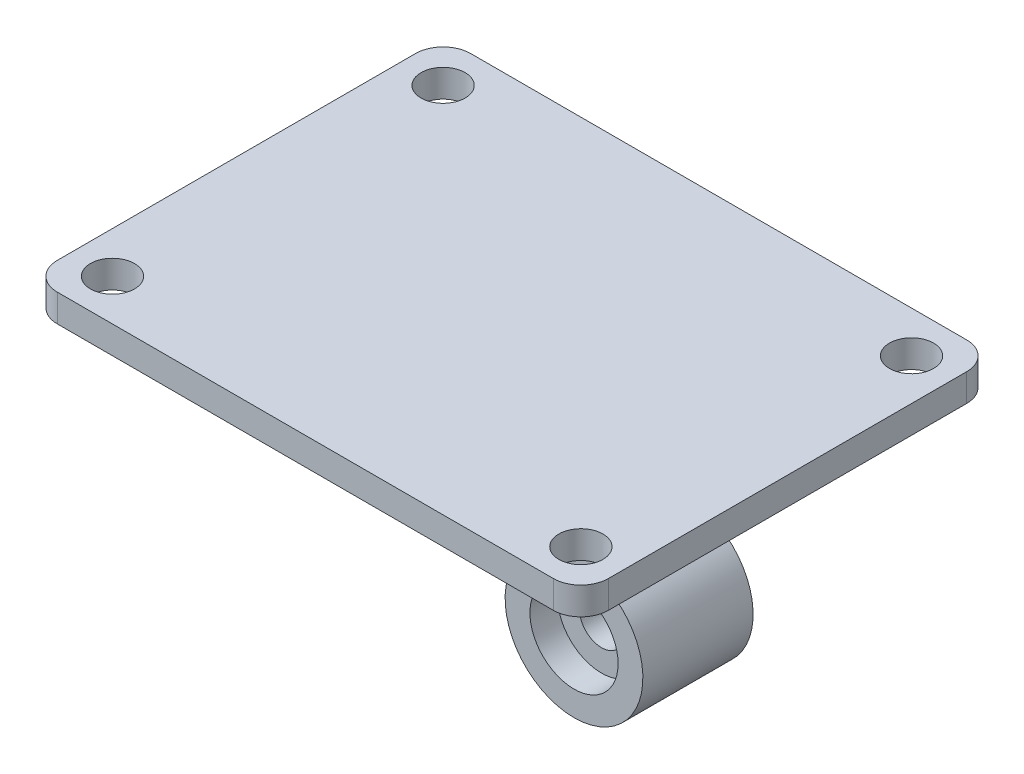
ISO-10303-21;
HEADER;
FILE_DESCRIPTION(('STEP AP214'),'2;1');
FILE_NAME('part.step','',(''),(''),'','','');
FILE_SCHEMA(('AUTOMOTIVE_DESIGN { 1 0 10303 214 1 1 1 1 }'));
ENDSEC;
DATA;
#1=APPLICATION_CONTEXT('core data for automotive mechanical design processes');
#2=APPLICATION_PROTOCOL_DEFINITION('international standard','automotive_design',2000,#1);
#3=PRODUCT_CONTEXT('',#1,'mechanical');
#4=PRODUCT('Part','Part','',(#3));
#5=PRODUCT_RELATED_PRODUCT_CATEGORY('part','',(#4));
#6=PRODUCT_DEFINITION_FORMATION('','',#4);
#7=PRODUCT_DEFINITION_CONTEXT('part definition',#1,'design');
#8=PRODUCT_DEFINITION('design','',#6,#7);
#9=PRODUCT_DEFINITION_SHAPE('','',#8);
#10=(LENGTH_UNIT() NAMED_UNIT(*) SI_UNIT(.MILLI.,.METRE.));
#11=(NAMED_UNIT(*) PLANE_ANGLE_UNIT() SI_UNIT($,.RADIAN.));
#12=(NAMED_UNIT(*) SI_UNIT($,.STERADIAN.) SOLID_ANGLE_UNIT());
#13=UNCERTAINTY_MEASURE_WITH_UNIT(LENGTH_MEASURE(1.E-05),#10,'distance_accuracy_value','');
#14=(GEOMETRIC_REPRESENTATION_CONTEXT(3) GLOBAL_UNCERTAINTY_ASSIGNED_CONTEXT((#13)) GLOBAL_UNIT_ASSIGNED_CONTEXT((#10,
#11,#12)) REPRESENTATION_CONTEXT('',''));
#15=CARTESIAN_POINT('',(0.,0.,0.));
#16=DIRECTION('',(0.,0.,1.));
#17=DIRECTION('',(1.,0.,0.));
#18=AXIS2_PLACEMENT_3D('',#15,#16,#17);
#19=CARTESIAN_POINT('',(0.,0.,-8.));
#20=DIRECTION('',(0.,0.,1.));
#21=DIRECTION('',(1.,0.,0.));
#22=AXIS2_PLACEMENT_3D('',#19,#20,#21);
#23=PLANE('',#22);
#24=CARTESIAN_POINT('',(-10.,5.,-8.));
#25=DIRECTION('',(0.,0.,1.));
#26=DIRECTION('',(1.,0.,0.));
#27=AXIS2_PLACEMENT_3D('',#24,#25,#26);
#28=CIRCLE('',#27,1.6);
#29=CARTESIAN_POINT('',(-8.4,5.,-8.));
#30=VERTEX_POINT('',#29);
#31=EDGE_CURVE('E194',#30,#30,#28,.T.);
#32=ORIENTED_EDGE('',*,*,#31,.T.);
#33=EDGE_LOOP('',(#32));
#34=FACE_BOUND('',#33,.T.);
#35=CARTESIAN_POINT('',(-10.,5.,-8.));
#36=DIRECTION('',(0.,0.,1.));
#37=DIRECTION('',(1.,0.,0.));
#38=AXIS2_PLACEMENT_3D('',#35,#36,#37);
#39=CIRCLE('',#38,5.);
#40=CARTESIAN_POINT('',(-7.5,9.33012701892219,-8.));
#41=VERTEX_POINT('',#40);
#42=CARTESIAN_POINT('',(-12.5,9.3301270189222,-8.));
#43=VERTEX_POINT('',#42);
#44=EDGE_CURVE('E163',#41,#43,#39,.T.);
#45=ORIENTED_EDGE('',*,*,#44,.F.);
#46=CARTESIAN_POINT('',(-10.,5.,-8.));
#47=DIRECTION('',(0.,0.,1.));
#48=DIRECTION('',(1.,0.,0.));
#49=AXIS2_PLACEMENT_3D('',#46,#47,#48);
#50=CIRCLE('',#49,5.);
#51=EDGE_CURVE('E197',#43,#41,#50,.T.);
#52=ORIENTED_EDGE('',*,*,#51,.F.);
#53=EDGE_LOOP('',(#45,#52));
#54=FACE_BOUND('',#53,.T.);
#55=ADVANCED_FACE('F35',(#34,#54),#23,.F.);
#56=CARTESIAN_POINT('',(0.,13.,0.));
#57=DIRECTION('',(0.,-1.,0.));
#58=DIRECTION('',(1.,0.,0.));
#59=AXIS2_PLACEMENT_3D('',#56,#57,#58);
#60=PLANE('',#59);
#61=CARTESIAN_POINT('',(-5.49999999999976,13.,-20.));
#62=DIRECTION('',(0.,-1.,0.));
#63=DIRECTION('',(1.,0.,0.));
#64=AXIS2_PLACEMENT_3D('',#61,#62,#63);
#65=CIRCLE('',#64,1.6);
#66=CARTESIAN_POINT('',(-3.89999999999976,13.,-20.));
#67=VERTEX_POINT('',#66);
#68=EDGE_CURVE('E373',#67,#67,#65,.T.);
#69=ORIENTED_EDGE('',*,*,#68,.F.);
#70=EDGE_LOOP('',(#69));
#71=FACE_BOUND('',#70,.T.);
#72=CARTESIAN_POINT('',(-39.4999999999998,13.,-20.0000000000002));
#73=DIRECTION('',(0.,-1.,0.));
#74=DIRECTION('',(1.,0.,0.));
#75=AXIS2_PLACEMENT_3D('',#72,#73,#74);
#76=CIRCLE('',#75,1.6);
#77=CARTESIAN_POINT('',(-37.8999999999998,13.,-20.0000000000002));
#78=VERTEX_POINT('',#77);
#79=EDGE_CURVE('E379',#78,#78,#76,.T.);
#80=ORIENTED_EDGE('',*,*,#79,.F.);
#81=EDGE_LOOP('',(#80));
#82=FACE_BOUND('',#81,.T.);
#83=CARTESIAN_POINT('',(-39.5,13.,3.99999999999976));
#84=DIRECTION('',(0.,-1.,0.));
#85=DIRECTION('',(1.,0.,0.));
#86=AXIS2_PLACEMENT_3D('',#83,#84,#85);
#87=CIRCLE('',#86,1.6);
#88=CARTESIAN_POINT('',(-37.9,13.,3.99999999999976));
#89=VERTEX_POINT('',#88);
#90=EDGE_CURVE('E387',#89,#89,#87,.T.);
#91=ORIENTED_EDGE('',*,*,#90,.F.);
#92=EDGE_LOOP('',(#91));
#93=FACE_BOUND('',#92,.T.);
#94=CARTESIAN_POINT('',(-5.50000000000001,13.,4.));
#95=DIRECTION('',(0.,-1.,0.));
#96=DIRECTION('',(1.,0.,0.));
#97=AXIS2_PLACEMENT_3D('',#94,#95,#96);
#98=CIRCLE('',#97,1.6);
#99=CARTESIAN_POINT('',(-3.90000000000001,13.,4.));
#100=VERTEX_POINT('',#99);
#101=EDGE_CURVE('E376',#100,#100,#98,.T.);
#102=ORIENTED_EDGE('',*,*,#101,.F.);
#103=EDGE_LOOP('',(#102));
#104=FACE_BOUND('',#103,.T.);
#105=DIRECTION('',(-1.,0.,0.));
#106=VECTOR('',#105,1.);
#107=CARTESIAN_POINT('',(-2.5,13.,-23.));
#108=LINE('',#107,#106);
#109=CARTESIAN_POINT('',(-4.5,13.,-23.));
#110=VERTEX_POINT('',#109);
#111=CARTESIAN_POINT('',(-40.5,13.,-23.));
#112=VERTEX_POINT('',#111);
#113=EDGE_CURVE('E170',#110,#112,#108,.T.);
#114=ORIENTED_EDGE('',*,*,#113,.F.);
#115=CARTESIAN_POINT('',(-4.5,13.,-21.));
#116=DIRECTION('',(0.,-1.,0.));
#117=DIRECTION('',(1.,0.,0.));
#118=AXIS2_PLACEMENT_3D('',#115,#116,#117);
#119=CIRCLE('',#118,2.);
#120=CARTESIAN_POINT('',(-2.5,13.,-21.));
#121=VERTEX_POINT('',#120);
#122=EDGE_CURVE('E231',#110,#121,#119,.T.);
#123=ORIENTED_EDGE('',*,*,#122,.T.);
#124=DIRECTION('',(0.,0.,-1.));
#125=VECTOR('',#124,1.);
#126=CARTESIAN_POINT('',(-2.5,13.,-23.));
#127=LINE('',#126,#125);
#128=CARTESIAN_POINT('',(-2.5,13.,5.));
#129=VERTEX_POINT('',#128);
#130=EDGE_CURVE('E183',#129,#121,#127,.T.);
#131=ORIENTED_EDGE('',*,*,#130,.F.);
#132=CARTESIAN_POINT('',(-4.5,13.,5.));
#133=DIRECTION('',(0.,-1.,0.));
#134=DIRECTION('',(1.,0.,0.));
#135=AXIS2_PLACEMENT_3D('',#132,#133,#134);
#136=CIRCLE('',#135,2.);
#137=CARTESIAN_POINT('',(-4.5,13.,7.));
#138=VERTEX_POINT('',#137);
#139=EDGE_CURVE('E225',#129,#138,#136,.T.);
#140=ORIENTED_EDGE('',*,*,#139,.T.);
#141=DIRECTION('',(1.,0.,0.));
#142=VECTOR('',#141,1.);
#143=CARTESIAN_POINT('',(-2.5,13.,7.));
#144=LINE('',#143,#142);
#145=CARTESIAN_POINT('',(-40.5,13.,7.));
#146=VERTEX_POINT('',#145);
#147=EDGE_CURVE('E181',#146,#138,#144,.T.);
#148=ORIENTED_EDGE('',*,*,#147,.F.);
#149=CARTESIAN_POINT('',(-40.5,13.,5.));
#150=DIRECTION('',(0.,-1.,0.));
#151=DIRECTION('',(1.,0.,0.));
#152=AXIS2_PLACEMENT_3D('',#149,#150,#151);
#153=CIRCLE('',#152,2.);
#154=CARTESIAN_POINT('',(-42.5,13.,5.));
#155=VERTEX_POINT('',#154);
#156=EDGE_CURVE('E227',#146,#155,#153,.T.);
#157=ORIENTED_EDGE('',*,*,#156,.T.);
#158=DIRECTION('',(0.,0.,1.));
#159=VECTOR('',#158,1.);
#160=CARTESIAN_POINT('',(-42.5,13.,-23.));
#161=LINE('',#160,#159);
#162=CARTESIAN_POINT('',(-42.5,13.,-21.));
#163=VERTEX_POINT('',#162);
#164=EDGE_CURVE('E166',#163,#155,#161,.T.);
#165=ORIENTED_EDGE('',*,*,#164,.F.);
#166=CARTESIAN_POINT('',(-40.5,13.,-21.));
#167=DIRECTION('',(0.,-1.,0.));
#168=DIRECTION('',(1.,0.,0.));
#169=AXIS2_PLACEMENT_3D('',#166,#167,#168);
#170=CIRCLE('',#169,2.);
#171=EDGE_CURVE('E229',#163,#112,#170,.T.);
#172=ORIENTED_EDGE('',*,*,#171,.T.);
#173=EDGE_LOOP('',(#114,#123,#131,#140,#148,#157,#165,#172));
#174=FACE_BOUND('',#173,.T.);
#175=DIRECTION('',(1.,0.,0.));
#176=VECTOR('',#175,1.);
#177=CARTESIAN_POINT('',(0.,13.,-16.));
#178=LINE('',#177,#176);
#179=CARTESIAN_POINT('',(-12.5,13.,-16.));
#180=VERTEX_POINT('',#179);
#181=CARTESIAN_POINT('',(-7.5,13.,-16.));
#182=VERTEX_POINT('',#181);
#183=EDGE_CURVE('E157',#180,#182,#178,.T.);
#184=ORIENTED_EDGE('',*,*,#183,.F.);
#185=DIRECTION('',(0.,0.,1.));
#186=VECTOR('',#185,1.);
#187=CARTESIAN_POINT('',(-12.5,13.,-8.));
#188=LINE('',#187,#186);
#189=CARTESIAN_POINT('',(-12.5,13.,0.));
#190=VERTEX_POINT('',#189);
#191=EDGE_CURVE('E213',#180,#190,#188,.T.);
#192=ORIENTED_EDGE('',*,*,#191,.T.);
#193=DIRECTION('',(1.,0.,0.));
#194=VECTOR('',#193,1.);
#195=CARTESIAN_POINT('',(0.,13.,0.));
#196=LINE('',#195,#194);
#197=CARTESIAN_POINT('',(-7.5,13.,0.));
#198=VERTEX_POINT('',#197);
#199=EDGE_CURVE('E205',#190,#198,#196,.T.);
#200=ORIENTED_EDGE('',*,*,#199,.T.);
#201=DIRECTION('',(0.,0.,1.));
#202=VECTOR('',#201,1.);
#203=CARTESIAN_POINT('',(-7.5,13.,-8.));
#204=LINE('',#203,#202);
#205=EDGE_CURVE('E216',#182,#198,#204,.T.);
#206=ORIENTED_EDGE('',*,*,#205,.F.);
#207=EDGE_LOOP('',(#184,#192,#200,#206));
#208=FACE_BOUND('',#207,.T.);
#209=ADVANCED_FACE('F259',(#71,#82,#93,#104,#174,#208),#60,.T.);
#210=CARTESIAN_POINT('',(-10.,5.,-8.));
#211=DIRECTION('',(0.,0.,1.));
#212=DIRECTION('',(1.,0.,0.));
#213=AXIS2_PLACEMENT_3D('',#210,#211,#212);
#214=CYLINDRICAL_SURFACE('',#213,1.6);
#215=ORIENTED_EDGE('',*,*,#31,.F.);
#216=EDGE_LOOP('',(#215));
#217=FACE_BOUND('',#216,.T.);
#218=CARTESIAN_POINT('',(-10.,5.,-2.));
#219=DIRECTION('',(0.,0.,1.));
#220=DIRECTION('',(1.,0.,0.));
#221=AXIS2_PLACEMENT_3D('',#218,#219,#220);
#222=CIRCLE('',#221,1.6);
#223=CARTESIAN_POINT('',(-8.4,5.,-2.));
#224=VERTEX_POINT('',#223);
#225=EDGE_CURVE('E191',#224,#224,#222,.F.);
#226=ORIENTED_EDGE('',*,*,#225,.F.);
#227=EDGE_LOOP('',(#226));
#228=FACE_BOUND('',#227,.T.);
#229=ADVANCED_FACE('F297',(#217,#228),#214,.F.);
#230=CARTESIAN_POINT('',(-10.,5.,-8.));
#231=DIRECTION('',(0.,0.,1.));
#232=DIRECTION('',(1.,0.,0.));
#233=AXIS2_PLACEMENT_3D('',#230,#231,#232);
#234=CYLINDRICAL_SURFACE('',#233,5.);
#235=CARTESIAN_POINT('',(-10.,5.,0.));
#236=DIRECTION('',(0.,0.,1.));
#237=DIRECTION('',(1.,0.,0.));
#238=AXIS2_PLACEMENT_3D('',#235,#236,#237);
#239=CIRCLE('',#238,5.);
#240=CARTESIAN_POINT('',(-12.5,9.3301270189222,0.));
#241=VERTEX_POINT('',#240);
#242=CARTESIAN_POINT('',(-7.5,9.33012701892219,0.));
#243=VERTEX_POINT('',#242);
#244=EDGE_CURVE('E200',#241,#243,#239,.T.);
#245=ORIENTED_EDGE('',*,*,#244,.F.);
#246=DIRECTION('',(0.,0.,1.));
#247=VECTOR('',#246,1.);
#248=CARTESIAN_POINT('',(-12.5,9.3301270189222,-8.));
#249=LINE('',#248,#247);
#250=EDGE_CURVE('E210',#43,#241,#249,.T.);
#251=ORIENTED_EDGE('',*,*,#250,.F.);
#252=ORIENTED_EDGE('',*,*,#51,.T.);
#253=DIRECTION('',(0.,0.,1.));
#254=VECTOR('',#253,1.);
#255=CARTESIAN_POINT('',(-7.5,9.33012701892219,-8.));
#256=LINE('',#255,#254);
#257=EDGE_CURVE('E138',#41,#243,#256,.T.);
#258=ORIENTED_EDGE('',*,*,#257,.T.);
#259=EDGE_LOOP('',(#245,#251,#252,#258));
#260=FACE_BOUND('',#259,.T.);
#261=ADVANCED_FACE('F313',(#260),#234,.T.);
#262=CARTESIAN_POINT('',(-12.5,0.,-8.));
#263=DIRECTION('',(1.,0.,0.));
#264=DIRECTION('',(0.,0.,-1.));
#265=AXIS2_PLACEMENT_3D('',#262,#263,#264);
#266=PLANE('',#265);
#267=DIRECTION('',(0.,1.,0.));
#268=VECTOR('',#267,1.);
#269=CARTESIAN_POINT('',(-12.5,0.,0.));
#270=LINE('',#269,#268);
#271=EDGE_CURVE('E198',#241,#190,#270,.T.);
#272=ORIENTED_EDGE('',*,*,#271,.T.);
#273=ORIENTED_EDGE('',*,*,#191,.F.);
#274=DIRECTION('',(0.,1.,0.));
#275=VECTOR('',#274,1.);
#276=CARTESIAN_POINT('',(-12.5,0.,-16.));
#277=LINE('',#276,#275);
#278=CARTESIAN_POINT('',(-12.5,9.3301270189222,-16.));
#279=VERTEX_POINT('',#278);
#280=EDGE_CURVE('E143',#279,#180,#277,.T.);
#281=ORIENTED_EDGE('',*,*,#280,.F.);
#282=DIRECTION('',(0.,0.,1.));
#283=VECTOR('',#282,1.);
#284=CARTESIAN_POINT('',(-12.5,9.3301270189222,-16.));
#285=LINE('',#284,#283);
#286=EDGE_CURVE('E142',#279,#43,#285,.T.);
#287=ORIENTED_EDGE('',*,*,#286,.T.);
#288=ORIENTED_EDGE('',*,*,#250,.T.);
#289=EDGE_LOOP('',(#272,#273,#281,#287,#288));
#290=FACE_BOUND('',#289,.T.);
#291=ADVANCED_FACE('F310',(#290),#266,.F.);
#292=CARTESIAN_POINT('',(-7.5,0.,-8.));
#293=DIRECTION('',(1.,0.,0.));
#294=DIRECTION('',(0.,0.,-1.));
#295=AXIS2_PLACEMENT_3D('',#292,#293,#294);
#296=PLANE('',#295);
#297=DIRECTION('',(0.,1.,0.));
#298=VECTOR('',#297,1.);
#299=CARTESIAN_POINT('',(-7.5,0.,0.));
#300=LINE('',#299,#298);
#301=EDGE_CURVE('E203',#243,#198,#300,.T.);
#302=ORIENTED_EDGE('',*,*,#301,.F.);
#303=ORIENTED_EDGE('',*,*,#257,.F.);
#304=DIRECTION('',(0.,0.,1.));
#305=VECTOR('',#304,1.);
#306=CARTESIAN_POINT('',(-7.5,9.33012701892219,-16.));
#307=LINE('',#306,#305);
#308=CARTESIAN_POINT('',(-7.5,9.33012701892219,-16.));
#309=VERTEX_POINT('',#308);
#310=EDGE_CURVE('E131',#309,#41,#307,.T.);
#311=ORIENTED_EDGE('',*,*,#310,.F.);
#312=DIRECTION('',(0.,1.,0.));
#313=VECTOR('',#312,1.);
#314=CARTESIAN_POINT('',(-7.5,0.,-16.));
#315=LINE('',#314,#313);
#316=EDGE_CURVE('E137',#309,#182,#315,.T.);
#317=ORIENTED_EDGE('',*,*,#316,.T.);
#318=ORIENTED_EDGE('',*,*,#205,.T.);
#319=EDGE_LOOP('',(#302,#303,#311,#317,#318));
#320=FACE_BOUND('',#319,.T.);
#321=ADVANCED_FACE('F134',(#320),#296,.T.);
#322=CARTESIAN_POINT('',(0.,0.,0.));
#323=DIRECTION('',(0.,0.,1.));
#324=DIRECTION('',(1.,0.,0.));
#325=AXIS2_PLACEMENT_3D('',#322,#323,#324);
#326=PLANE('',#325);
#327=ORIENTED_EDGE('',*,*,#271,.F.);
#328=ORIENTED_EDGE('',*,*,#244,.T.);
#329=ORIENTED_EDGE('',*,*,#301,.T.);
#330=ORIENTED_EDGE('',*,*,#199,.F.);
#331=EDGE_LOOP('',(#327,#328,#329,#330));
#332=FACE_BOUND('',#331,.T.);
#333=CARTESIAN_POINT('',(-10.,5.,0.));
#334=DIRECTION('',(0.,0.,1.));
#335=DIRECTION('',(1.,0.,0.));
#336=AXIS2_PLACEMENT_3D('',#333,#334,#335);
#337=CIRCLE('',#336,3.2);
#338=CARTESIAN_POINT('',(-6.8,5.,0.));
#339=VERTEX_POINT('',#338);
#340=EDGE_CURVE('E178',#339,#339,#337,.T.);
#341=ORIENTED_EDGE('',*,*,#340,.F.);
#342=EDGE_LOOP('',(#341));
#343=FACE_BOUND('',#342,.T.);
#344=ADVANCED_FACE('F305',(#332,#343),#326,.T.);
#345=CARTESIAN_POINT('',(-10.,5.,-2.));
#346=DIRECTION('',(0.,0.,1.));
#347=DIRECTION('',(1.,0.,0.));
#348=AXIS2_PLACEMENT_3D('',#345,#346,#347);
#349=PLANE('',#348);
#350=CARTESIAN_POINT('',(-10.,5.,-2.));
#351=DIRECTION('',(0.,0.,1.));
#352=DIRECTION('',(1.,0.,0.));
#353=AXIS2_PLACEMENT_3D('',#350,#351,#352);
#354=CIRCLE('',#353,3.2);
#355=CARTESIAN_POINT('',(-6.8,5.,-2.));
#356=VERTEX_POINT('',#355);
#357=EDGE_CURVE('E188',#356,#356,#354,.T.);
#358=ORIENTED_EDGE('',*,*,#357,.T.);
#359=EDGE_LOOP('',(#358));
#360=FACE_BOUND('',#359,.T.);
#361=ORIENTED_EDGE('',*,*,#225,.T.);
#362=EDGE_LOOP('',(#361));
#363=FACE_BOUND('',#362,.T.);
#364=ADVANCED_FACE('F308',(#360,#363),#349,.T.);
#365=CARTESIAN_POINT('',(-10.,5.,-2.));
#366=DIRECTION('',(0.,0.,1.));
#367=DIRECTION('',(1.,0.,0.));
#368=AXIS2_PLACEMENT_3D('',#365,#366,#367);
#369=CYLINDRICAL_SURFACE('',#368,3.2);
#370=ORIENTED_EDGE('',*,*,#357,.F.);
#371=EDGE_LOOP('',(#370));
#372=FACE_BOUND('',#371,.T.);
#373=ORIENTED_EDGE('',*,*,#340,.T.);
#374=EDGE_LOOP('',(#373));
#375=FACE_BOUND('',#374,.T.);
#376=ADVANCED_FACE('F303',(#372,#375),#369,.F.);
#377=CARTESIAN_POINT('',(-42.5,15.,-23.));
#378=DIRECTION('',(1.,0.,0.));
#379=DIRECTION('',(0.,1.,0.));
#380=AXIS2_PLACEMENT_3D('',#377,#378,#379);
#381=PLANE('',#380);
#382=DIRECTION('',(0.,0.,1.));
#383=VECTOR('',#382,1.);
#384=CARTESIAN_POINT('',(-42.5,15.,-23.));
#385=LINE('',#384,#383);
#386=CARTESIAN_POINT('',(-42.5,15.,-21.));
#387=VERTEX_POINT('',#386);
#388=CARTESIAN_POINT('',(-42.5,15.,5.));
#389=VERTEX_POINT('',#388);
#390=EDGE_CURVE('E167',#387,#389,#385,.T.);
#391=ORIENTED_EDGE('',*,*,#390,.F.);
#392=DIRECTION('',(0.,-1.,0.));
#393=VECTOR('',#392,1.);
#394=CARTESIAN_POINT('',(-42.5,15.,-21.));
#395=LINE('',#394,#393);
#396=EDGE_CURVE('E247',#387,#163,#395,.T.);
#397=ORIENTED_EDGE('',*,*,#396,.T.);
#398=ORIENTED_EDGE('',*,*,#164,.T.);
#399=DIRECTION('',(0.,-1.,0.));
#400=VECTOR('',#399,1.);
#401=CARTESIAN_POINT('',(-42.5,15.,5.));
#402=LINE('',#401,#400);
#403=EDGE_CURVE('E245',#155,#389,#402,.F.);
#404=ORIENTED_EDGE('',*,*,#403,.T.);
#405=EDGE_LOOP('',(#391,#397,#398,#404));
#406=FACE_BOUND('',#405,.T.);
#407=ADVANCED_FACE('F253',(#406),#381,.F.);
#408=CARTESIAN_POINT('',(-2.5,15.,7.));
#409=DIRECTION('',(0.,0.,-1.));
#410=DIRECTION('',(-1.,0.,0.));
#411=AXIS2_PLACEMENT_3D('',#408,#409,#410);
#412=PLANE('',#411);
#413=DIRECTION('',(1.,0.,0.));
#414=VECTOR('',#413,1.);
#415=CARTESIAN_POINT('',(-2.5,15.,7.));
#416=LINE('',#415,#414);
#417=CARTESIAN_POINT('',(-40.5,15.,7.));
#418=VERTEX_POINT('',#417);
#419=CARTESIAN_POINT('',(-4.5,15.,7.));
#420=VERTEX_POINT('',#419);
#421=EDGE_CURVE('E169',#418,#420,#416,.T.);
#422=ORIENTED_EDGE('',*,*,#421,.F.);
#423=DIRECTION('',(0.,-1.,0.));
#424=VECTOR('',#423,1.);
#425=CARTESIAN_POINT('',(-40.5,15.,7.));
#426=LINE('',#425,#424);
#427=EDGE_CURVE('E11',#418,#146,#426,.T.);
#428=ORIENTED_EDGE('',*,*,#427,.T.);
#429=ORIENTED_EDGE('',*,*,#147,.T.);
#430=DIRECTION('',(0.,-1.,0.));
#431=VECTOR('',#430,1.);
#432=CARTESIAN_POINT('',(-4.5,15.,7.));
#433=LINE('',#432,#431);
#434=EDGE_CURVE('E43',#138,#420,#433,.F.);
#435=ORIENTED_EDGE('',*,*,#434,.T.);
#436=EDGE_LOOP('',(#422,#428,#429,#435));
#437=FACE_BOUND('',#436,.T.);
#438=ADVANCED_FACE('F265',(#437),#412,.F.);
#439=CARTESIAN_POINT('',(-2.5,15.,-23.));
#440=DIRECTION('',(-1.,0.,0.));
#441=DIRECTION('',(0.,-1.,0.));
#442=AXIS2_PLACEMENT_3D('',#439,#440,#441);
#443=PLANE('',#442);
#444=ORIENTED_EDGE('',*,*,#130,.T.);
#445=DIRECTION('',(0.,-1.,0.));
#446=VECTOR('',#445,1.);
#447=CARTESIAN_POINT('',(-2.5,15.,-21.));
#448=LINE('',#447,#446);
#449=CARTESIAN_POINT('',(-2.5,15.,-21.));
#450=VERTEX_POINT('',#449);
#451=EDGE_CURVE('E236',#121,#450,#448,.F.);
#452=ORIENTED_EDGE('',*,*,#451,.T.);
#453=DIRECTION('',(0.,0.,-1.));
#454=VECTOR('',#453,1.);
#455=CARTESIAN_POINT('',(-2.5,15.,-23.));
#456=LINE('',#455,#454);
#457=CARTESIAN_POINT('',(-2.5,15.,5.));
#458=VERTEX_POINT('',#457);
#459=EDGE_CURVE('E172',#458,#450,#456,.T.);
#460=ORIENTED_EDGE('',*,*,#459,.F.);
#461=DIRECTION('',(0.,-1.,0.));
#462=VECTOR('',#461,1.);
#463=CARTESIAN_POINT('',(-2.5,15.,5.));
#464=LINE('',#463,#462);
#465=EDGE_CURVE('E233',#458,#129,#464,.T.);
#466=ORIENTED_EDGE('',*,*,#465,.T.);
#467=EDGE_LOOP('',(#444,#452,#460,#466));
#468=FACE_BOUND('',#467,.T.);
#469=ADVANCED_FACE('F273',(#468),#443,.F.);
#470=CARTESIAN_POINT('',(-2.5,15.,-23.));
#471=DIRECTION('',(0.,0.,1.));
#472=DIRECTION('',(1.,0.,0.));
#473=AXIS2_PLACEMENT_3D('',#470,#471,#472);
#474=PLANE('',#473);
#475=DIRECTION('',(-1.,0.,0.));
#476=VECTOR('',#475,1.);
#477=CARTESIAN_POINT('',(-2.5,15.,-23.));
#478=LINE('',#477,#476);
#479=CARTESIAN_POINT('',(-4.5,15.,-23.));
#480=VERTEX_POINT('',#479);
#481=CARTESIAN_POINT('',(-40.5,15.,-23.));
#482=VERTEX_POINT('',#481);
#483=EDGE_CURVE('E175',#480,#482,#478,.T.);
#484=ORIENTED_EDGE('',*,*,#483,.F.);
#485=DIRECTION('',(0.,-1.,0.));
#486=VECTOR('',#485,1.);
#487=CARTESIAN_POINT('',(-4.5,15.,-23.));
#488=LINE('',#487,#486);
#489=EDGE_CURVE('E222',#480,#110,#488,.T.);
#490=ORIENTED_EDGE('',*,*,#489,.T.);
#491=ORIENTED_EDGE('',*,*,#113,.T.);
#492=DIRECTION('',(0.,-1.,0.));
#493=VECTOR('',#492,1.);
#494=CARTESIAN_POINT('',(-40.5,15.,-23.));
#495=LINE('',#494,#493);
#496=EDGE_CURVE('E212',#112,#482,#495,.F.);
#497=ORIENTED_EDGE('',*,*,#496,.T.);
#498=EDGE_LOOP('',(#484,#490,#491,#497));
#499=FACE_BOUND('',#498,.T.);
#500=ADVANCED_FACE('F281',(#499),#474,.F.);
#501=CARTESIAN_POINT('',(0.,15.,0.));
#502=DIRECTION('',(0.,-1.,0.));
#503=DIRECTION('',(1.,0.,0.));
#504=AXIS2_PLACEMENT_3D('',#501,#502,#503);
#505=PLANE('',#504);
#506=CARTESIAN_POINT('',(-5.49999999999976,15.,-20.));
#507=DIRECTION('',(0.,-1.,0.));
#508=DIRECTION('',(1.,0.,0.));
#509=AXIS2_PLACEMENT_3D('',#506,#507,#508);
#510=CIRCLE('',#509,1.6);
#511=CARTESIAN_POINT('',(-3.89999999999976,15.,-20.));
#512=VERTEX_POINT('',#511);
#513=EDGE_CURVE('E370',#512,#512,#510,.T.);
#514=ORIENTED_EDGE('',*,*,#513,.T.);
#515=EDGE_LOOP('',(#514));
#516=FACE_BOUND('',#515,.T.);
#517=CARTESIAN_POINT('',(-39.4999999999998,15.,-20.0000000000002));
#518=DIRECTION('',(0.,-1.,0.));
#519=DIRECTION('',(1.,0.,0.));
#520=AXIS2_PLACEMENT_3D('',#517,#518,#519);
#521=CIRCLE('',#520,1.6);
#522=CARTESIAN_POINT('',(-37.8999999999998,15.,-20.0000000000002));
#523=VERTEX_POINT('',#522);
#524=EDGE_CURVE('E374',#523,#523,#521,.T.);
#525=ORIENTED_EDGE('',*,*,#524,.T.);
#526=EDGE_LOOP('',(#525));
#527=FACE_BOUND('',#526,.T.);
#528=CARTESIAN_POINT('',(-39.5,15.,3.99999999999976));
#529=DIRECTION('',(0.,-1.,0.));
#530=DIRECTION('',(1.,0.,0.));
#531=AXIS2_PLACEMENT_3D('',#528,#529,#530);
#532=CIRCLE('',#531,1.6);
#533=CARTESIAN_POINT('',(-37.9,15.,3.99999999999976));
#534=VERTEX_POINT('',#533);
#535=EDGE_CURVE('E384',#534,#534,#532,.T.);
#536=ORIENTED_EDGE('',*,*,#535,.T.);
#537=EDGE_LOOP('',(#536));
#538=FACE_BOUND('',#537,.T.);
#539=CARTESIAN_POINT('',(-5.50000000000001,15.,4.));
#540=DIRECTION('',(0.,-1.,0.));
#541=DIRECTION('',(1.,0.,0.));
#542=AXIS2_PLACEMENT_3D('',#539,#540,#541);
#543=CIRCLE('',#542,1.6);
#544=CARTESIAN_POINT('',(-3.90000000000001,15.,4.));
#545=VERTEX_POINT('',#544);
#546=EDGE_CURVE('E152',#545,#545,#543,.T.);
#547=ORIENTED_EDGE('',*,*,#546,.T.);
#548=EDGE_LOOP('',(#547));
#549=FACE_BOUND('',#548,.T.);
#550=ORIENTED_EDGE('',*,*,#459,.T.);
#551=CARTESIAN_POINT('',(-4.5,15.,-21.));
#552=DIRECTION('',(0.,-1.,0.));
#553=DIRECTION('',(1.,0.,0.));
#554=AXIS2_PLACEMENT_3D('',#551,#552,#553);
#555=CIRCLE('',#554,2.);
#556=EDGE_CURVE('E243',#450,#480,#555,.F.);
#557=ORIENTED_EDGE('',*,*,#556,.T.);
#558=ORIENTED_EDGE('',*,*,#483,.T.);
#559=CARTESIAN_POINT('',(-40.5,15.,-21.));
#560=DIRECTION('',(0.,-1.,0.));
#561=DIRECTION('',(1.,0.,0.));
#562=AXIS2_PLACEMENT_3D('',#559,#560,#561);
#563=CIRCLE('',#562,2.);
#564=EDGE_CURVE('E241',#482,#387,#563,.F.);
#565=ORIENTED_EDGE('',*,*,#564,.T.);
#566=ORIENTED_EDGE('',*,*,#390,.T.);
#567=CARTESIAN_POINT('',(-40.5,15.,5.));
#568=DIRECTION('',(0.,-1.,0.));
#569=DIRECTION('',(1.,0.,0.));
#570=AXIS2_PLACEMENT_3D('',#567,#568,#569);
#571=CIRCLE('',#570,2.);
#572=EDGE_CURVE('E56',#389,#418,#571,.F.);
#573=ORIENTED_EDGE('',*,*,#572,.T.);
#574=ORIENTED_EDGE('',*,*,#421,.T.);
#575=CARTESIAN_POINT('',(-4.5,15.,5.));
#576=DIRECTION('',(0.,-1.,0.));
#577=DIRECTION('',(1.,0.,0.));
#578=AXIS2_PLACEMENT_3D('',#575,#576,#577);
#579=CIRCLE('',#578,2.);
#580=EDGE_CURVE('E238',#420,#458,#579,.F.);
#581=ORIENTED_EDGE('',*,*,#580,.T.);
#582=EDGE_LOOP('',(#550,#557,#558,#565,#566,#573,#574,#581));
#583=FACE_BOUND('',#582,.T.);
#584=ADVANCED_FACE('F267',(#516,#527,#538,#549,#583),#505,.F.);
#585=CARTESIAN_POINT('',(-10.,5.,-16.));
#586=DIRECTION('',(0.,0.,1.));
#587=DIRECTION('',(1.,0.,0.));
#588=AXIS2_PLACEMENT_3D('',#585,#586,#587);
#589=CYLINDRICAL_SURFACE('',#588,5.);
#590=ORIENTED_EDGE('',*,*,#310,.T.);
#591=ORIENTED_EDGE('',*,*,#44,.T.);
#592=ORIENTED_EDGE('',*,*,#286,.F.);
#593=CARTESIAN_POINT('',(-10.,5.,-16.));
#594=DIRECTION('',(0.,0.,1.));
#595=DIRECTION('',(1.,0.,0.));
#596=AXIS2_PLACEMENT_3D('',#593,#594,#595);
#597=CIRCLE('',#596,5.);
#598=EDGE_CURVE('E147',#309,#279,#597,.T.);
#599=ORIENTED_EDGE('',*,*,#598,.F.);
#600=EDGE_LOOP('',(#590,#591,#592,#599));
#601=FACE_BOUND('',#600,.T.);
#602=ADVANCED_FACE('F148',(#601),#589,.F.);
#603=CARTESIAN_POINT('',(0.,0.,-16.));
#604=DIRECTION('',(0.,0.,1.));
#605=DIRECTION('',(1.,0.,0.));
#606=AXIS2_PLACEMENT_3D('',#603,#604,#605);
#607=PLANE('',#606);
#608=ORIENTED_EDGE('',*,*,#598,.T.);
#609=ORIENTED_EDGE('',*,*,#280,.T.);
#610=ORIENTED_EDGE('',*,*,#183,.T.);
#611=ORIENTED_EDGE('',*,*,#316,.F.);
#612=EDGE_LOOP('',(#608,#609,#610,#611));
#613=FACE_BOUND('',#612,.T.);
#614=ADVANCED_FACE('F155',(#613),#607,.F.);
#615=CARTESIAN_POINT('',(-4.5,15.,-21.));
#616=DIRECTION('',(0.,-1.,0.));
#617=DIRECTION('',(1.,0.,0.));
#618=AXIS2_PLACEMENT_3D('',#615,#616,#617);
#619=CYLINDRICAL_SURFACE('',#618,2.);
#620=ORIENTED_EDGE('',*,*,#556,.F.);
#621=ORIENTED_EDGE('',*,*,#451,.F.);
#622=ORIENTED_EDGE('',*,*,#122,.F.);
#623=ORIENTED_EDGE('',*,*,#489,.F.);
#624=EDGE_LOOP('',(#620,#621,#622,#623));
#625=FACE_BOUND('',#624,.T.);
#626=ADVANCED_FACE('F278',(#625),#619,.T.);
#627=CARTESIAN_POINT('',(-40.5,15.,-21.));
#628=DIRECTION('',(0.,-1.,0.));
#629=DIRECTION('',(1.,0.,0.));
#630=AXIS2_PLACEMENT_3D('',#627,#628,#629);
#631=CYLINDRICAL_SURFACE('',#630,2.);
#632=ORIENTED_EDGE('',*,*,#564,.F.);
#633=ORIENTED_EDGE('',*,*,#496,.F.);
#634=ORIENTED_EDGE('',*,*,#171,.F.);
#635=ORIENTED_EDGE('',*,*,#396,.F.);
#636=EDGE_LOOP('',(#632,#633,#634,#635));
#637=FACE_BOUND('',#636,.T.);
#638=ADVANCED_FACE('F283',(#637),#631,.T.);
#639=CARTESIAN_POINT('',(-40.5,15.,5.));
#640=DIRECTION('',(0.,-1.,0.));
#641=DIRECTION('',(1.,0.,0.));
#642=AXIS2_PLACEMENT_3D('',#639,#640,#641);
#643=CYLINDRICAL_SURFACE('',#642,2.);
#644=ORIENTED_EDGE('',*,*,#572,.F.);
#645=ORIENTED_EDGE('',*,*,#403,.F.);
#646=ORIENTED_EDGE('',*,*,#156,.F.);
#647=ORIENTED_EDGE('',*,*,#427,.F.);
#648=EDGE_LOOP('',(#644,#645,#646,#647));
#649=FACE_BOUND('',#648,.T.);
#650=ADVANCED_FACE('F264',(#649),#643,.T.);
#651=CARTESIAN_POINT('',(-4.5,15.,5.));
#652=DIRECTION('',(0.,-1.,0.));
#653=DIRECTION('',(1.,0.,0.));
#654=AXIS2_PLACEMENT_3D('',#651,#652,#653);
#655=CYLINDRICAL_SURFACE('',#654,2.);
#656=ORIENTED_EDGE('',*,*,#580,.F.);
#657=ORIENTED_EDGE('',*,*,#434,.F.);
#658=ORIENTED_EDGE('',*,*,#139,.F.);
#659=ORIENTED_EDGE('',*,*,#465,.F.);
#660=EDGE_LOOP('',(#656,#657,#658,#659));
#661=FACE_BOUND('',#660,.T.);
#662=ADVANCED_FACE('F37',(#661),#655,.T.);
#663=CARTESIAN_POINT('',(-5.50000000000001,15.,4.));
#664=DIRECTION('',(0.,-1.,0.));
#665=DIRECTION('',(1.,0.,0.));
#666=AXIS2_PLACEMENT_3D('',#663,#664,#665);
#667=CYLINDRICAL_SURFACE('',#666,1.6);
#668=ORIENTED_EDGE('',*,*,#546,.F.);
#669=EDGE_LOOP('',(#668));
#670=FACE_BOUND('',#669,.T.);
#671=ORIENTED_EDGE('',*,*,#101,.T.);
#672=EDGE_LOOP('',(#671));
#673=FACE_BOUND('',#672,.T.);
#674=ADVANCED_FACE('F350',(#670,#673),#667,.F.);
#675=CARTESIAN_POINT('',(-39.5,15.,3.99999999999976));
#676=DIRECTION('',(0.,-1.,0.));
#677=DIRECTION('',(1.,0.,0.));
#678=AXIS2_PLACEMENT_3D('',#675,#676,#677);
#679=CYLINDRICAL_SURFACE('',#678,1.6);
#680=ORIENTED_EDGE('',*,*,#535,.F.);
#681=EDGE_LOOP('',(#680));
#682=FACE_BOUND('',#681,.T.);
#683=ORIENTED_EDGE('',*,*,#90,.T.);
#684=EDGE_LOOP('',(#683));
#685=FACE_BOUND('',#684,.T.);
#686=ADVANCED_FACE('F353',(#682,#685),#679,.F.);
#687=CARTESIAN_POINT('',(-39.4999999999998,15.,-20.0000000000002));
#688=DIRECTION('',(0.,-1.,0.));
#689=DIRECTION('',(1.,0.,0.));
#690=AXIS2_PLACEMENT_3D('',#687,#688,#689);
#691=CYLINDRICAL_SURFACE('',#690,1.6);
#692=ORIENTED_EDGE('',*,*,#524,.F.);
#693=EDGE_LOOP('',(#692));
#694=FACE_BOUND('',#693,.T.);
#695=ORIENTED_EDGE('',*,*,#79,.T.);
#696=EDGE_LOOP('',(#695));
#697=FACE_BOUND('',#696,.T.);
#698=ADVANCED_FACE('F357',(#694,#697),#691,.F.);
#699=CARTESIAN_POINT('',(-5.49999999999976,15.,-20.));
#700=DIRECTION('',(0.,-1.,0.));
#701=DIRECTION('',(1.,0.,0.));
#702=AXIS2_PLACEMENT_3D('',#699,#700,#701);
#703=CYLINDRICAL_SURFACE('',#702,1.6);
#704=ORIENTED_EDGE('',*,*,#513,.F.);
#705=EDGE_LOOP('',(#704));
#706=FACE_BOUND('',#705,.T.);
#707=ORIENTED_EDGE('',*,*,#68,.T.);
#708=EDGE_LOOP('',(#707));
#709=FACE_BOUND('',#708,.T.);
#710=ADVANCED_FACE('F361',(#706,#709),#703,.F.);
#711=CLOSED_SHELL('',(#55,#209,#229,#261,#291,#321,#344,#364,#376,#407,#438,#469,#500,#584,#602,
#614,#626,#638,#650,#662,#674,#686,#698,#710));
#712=MANIFOLD_SOLID_BREP('B2',#711);
#713=ADVANCED_BREP_SHAPE_REPRESENTATION('',(#18,#712),#14);
#714=SHAPE_DEFINITION_REPRESENTATION(#9,#713);
ENDSEC;
END-ISO-10303-21;
